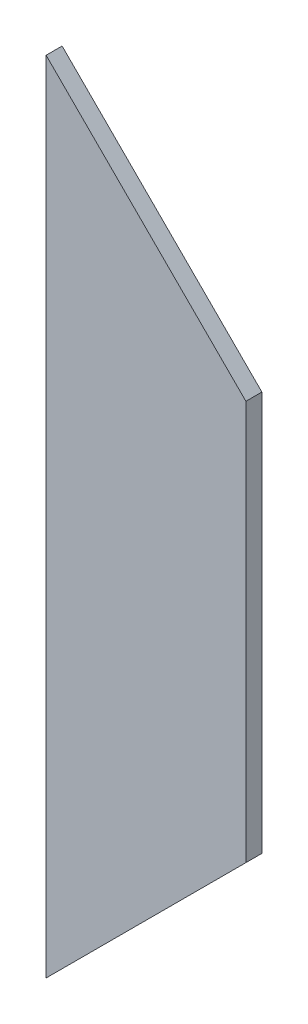
ISO-10303-21;
HEADER;
FILE_DESCRIPTION(('STEP AP214'),'2;1');
FILE_NAME('part.step','',(''),(''),'','','');
FILE_SCHEMA(('AUTOMOTIVE_DESIGN { 1 0 10303 214 1 1 1 1 }'));
ENDSEC;
DATA;
#1=APPLICATION_CONTEXT('core data for automotive mechanical design processes');
#2=APPLICATION_PROTOCOL_DEFINITION('international standard','automotive_design',2000,#1);
#3=PRODUCT_CONTEXT('',#1,'mechanical');
#4=PRODUCT('Part','Part','',(#3));
#5=PRODUCT_RELATED_PRODUCT_CATEGORY('part','',(#4));
#6=PRODUCT_DEFINITION_FORMATION('','',#4);
#7=PRODUCT_DEFINITION_CONTEXT('part definition',#1,'design');
#8=PRODUCT_DEFINITION('design','',#6,#7);
#9=PRODUCT_DEFINITION_SHAPE('','',#8);
#10=(LENGTH_UNIT() NAMED_UNIT(*) SI_UNIT(.MILLI.,.METRE.));
#11=(NAMED_UNIT(*) PLANE_ANGLE_UNIT() SI_UNIT($,.RADIAN.));
#12=(NAMED_UNIT(*) SI_UNIT($,.STERADIAN.) SOLID_ANGLE_UNIT());
#13=UNCERTAINTY_MEASURE_WITH_UNIT(LENGTH_MEASURE(1.E-05),#10,'distance_accuracy_value','');
#14=(GEOMETRIC_REPRESENTATION_CONTEXT(3) GLOBAL_UNCERTAINTY_ASSIGNED_CONTEXT((#13)) GLOBAL_UNIT_ASSIGNED_CONTEXT((#10,
#11,#12)) REPRESENTATION_CONTEXT('',''));
#15=CARTESIAN_POINT('',(0.,0.,0.));
#16=DIRECTION('',(0.,0.,1.));
#17=DIRECTION('',(1.,0.,0.));
#18=AXIS2_PLACEMENT_3D('',#15,#16,#17);
#19=CARTESIAN_POINT('',(0.,0.,4.));
#20=DIRECTION('',(-0.707106781186546,0.707106781186549,0.));
#21=DIRECTION('',(-0.707106781186549,-0.707106781186546,0.));
#22=AXIS2_PLACEMENT_3D('',#19,#20,#21);
#23=PLANE('',#22);
#24=DIRECTION('',(0.707106781186549,0.707106781186546,0.));
#25=VECTOR('',#24,1.);
#26=CARTESIAN_POINT('',(0.,0.,0.));
#27=LINE('',#26,#25);
#28=CARTESIAN_POINT('',(0.,0.,0.));
#29=VERTEX_POINT('',#28);
#30=CARTESIAN_POINT('',(50.,49.9999999999998,0.));
#31=VERTEX_POINT('',#30);
#32=EDGE_CURVE('E99',#29,#31,#27,.T.);
#33=ORIENTED_EDGE('',*,*,#32,.T.);
#34=DIRECTION('',(0.,0.,-1.));
#35=VECTOR('',#34,1.);
#36=CARTESIAN_POINT('',(50.,49.9999999999998,4.));
#37=LINE('',#36,#35);
#38=CARTESIAN_POINT('',(50.,49.9999999999998,4.));
#39=VERTEX_POINT('',#38);
#40=EDGE_CURVE('E11',#39,#31,#37,.T.);
#41=ORIENTED_EDGE('',*,*,#40,.F.);
#42=DIRECTION('',(0.707106781186549,0.707106781186546,0.));
#43=VECTOR('',#42,1.);
#44=CARTESIAN_POINT('',(0.,0.,4.));
#45=LINE('',#44,#43);
#46=CARTESIAN_POINT('',(0.,0.,4.));
#47=VERTEX_POINT('',#46);
#48=EDGE_CURVE('E87',#47,#39,#45,.T.);
#49=ORIENTED_EDGE('',*,*,#48,.F.);
#50=DIRECTION('',(0.,0.,-1.));
#51=VECTOR('',#50,1.);
#52=CARTESIAN_POINT('',(0.,0.,4.));
#53=LINE('',#52,#51);
#54=EDGE_CURVE('E95',#47,#29,#53,.T.);
#55=ORIENTED_EDGE('',*,*,#54,.T.);
#56=EDGE_LOOP('',(#33,#41,#49,#55));
#57=FACE_BOUND('',#56,.T.);
#58=ADVANCED_FACE('F36',(#57),#23,.F.);
#59=CARTESIAN_POINT('',(50.,49.9999999999998,4.));
#60=DIRECTION('',(-1.,0.,0.));
#61=DIRECTION('',(0.,0.,1.));
#62=AXIS2_PLACEMENT_3D('',#59,#60,#61);
#63=PLANE('',#62);
#64=DIRECTION('',(0.,1.,0.));
#65=VECTOR('',#64,1.);
#66=CARTESIAN_POINT('',(50.,49.9999999999998,0.));
#67=LINE('',#66,#65);
#68=CARTESIAN_POINT('',(50.,150.,0.));
#69=VERTEX_POINT('',#68);
#70=EDGE_CURVE('E91',#31,#69,#67,.T.);
#71=ORIENTED_EDGE('',*,*,#70,.T.);
#72=DIRECTION('',(0.,0.,-1.));
#73=VECTOR('',#72,1.);
#74=CARTESIAN_POINT('',(50.,150.,4.));
#75=LINE('',#74,#73);
#76=CARTESIAN_POINT('',(50.,150.,4.));
#77=VERTEX_POINT('',#76);
#78=EDGE_CURVE('E44',#77,#69,#75,.T.);
#79=ORIENTED_EDGE('',*,*,#78,.F.);
#80=DIRECTION('',(0.,1.,0.));
#81=VECTOR('',#80,1.);
#82=CARTESIAN_POINT('',(50.,49.9999999999998,4.));
#83=LINE('',#82,#81);
#84=EDGE_CURVE('E82',#39,#77,#83,.T.);
#85=ORIENTED_EDGE('',*,*,#84,.F.);
#86=ORIENTED_EDGE('',*,*,#40,.T.);
#87=EDGE_LOOP('',(#71,#79,#85,#86));
#88=FACE_BOUND('',#87,.T.);
#89=ADVANCED_FACE('F90',(#88),#63,.F.);
#90=CARTESIAN_POINT('',(50.,150.,4.));
#91=DIRECTION('',(-0.707106781186546,-0.707106781186549,0.));
#92=DIRECTION('',(0.707106781186549,-0.707106781186546,0.));
#93=AXIS2_PLACEMENT_3D('',#90,#91,#92);
#94=PLANE('',#93);
#95=DIRECTION('',(-0.707106781186549,0.707106781186546,0.));
#96=VECTOR('',#95,1.);
#97=CARTESIAN_POINT('',(50.,150.,0.));
#98=LINE('',#97,#96);
#99=CARTESIAN_POINT('',(0.,200.,0.));
#100=VERTEX_POINT('',#99);
#101=EDGE_CURVE('E69',#69,#100,#98,.T.);
#102=ORIENTED_EDGE('',*,*,#101,.T.);
#103=DIRECTION('',(0.,0.,-1.));
#104=VECTOR('',#103,1.);
#105=CARTESIAN_POINT('',(0.,200.,4.));
#106=LINE('',#105,#104);
#107=CARTESIAN_POINT('',(0.,200.,4.));
#108=VERTEX_POINT('',#107);
#109=EDGE_CURVE('E92',#108,#100,#106,.T.);
#110=ORIENTED_EDGE('',*,*,#109,.F.);
#111=DIRECTION('',(-0.707106781186549,0.707106781186546,0.));
#112=VECTOR('',#111,1.);
#113=CARTESIAN_POINT('',(50.,150.,4.));
#114=LINE('',#113,#112);
#115=EDGE_CURVE('E85',#77,#108,#114,.T.);
#116=ORIENTED_EDGE('',*,*,#115,.F.);
#117=ORIENTED_EDGE('',*,*,#78,.T.);
#118=EDGE_LOOP('',(#102,#110,#116,#117));
#119=FACE_BOUND('',#118,.T.);
#120=ADVANCED_FACE('F93',(#119),#94,.F.);
#121=CARTESIAN_POINT('',(0.,0.,4.));
#122=DIRECTION('',(1.,0.,0.));
#123=DIRECTION('',(0.,0.,-1.));
#124=AXIS2_PLACEMENT_3D('',#121,#122,#123);
#125=PLANE('',#124);
#126=DIRECTION('',(0.,-1.,0.));
#127=VECTOR('',#126,1.);
#128=CARTESIAN_POINT('',(0.,0.,0.));
#129=LINE('',#128,#127);
#130=EDGE_CURVE('E75',#100,#29,#129,.T.);
#131=ORIENTED_EDGE('',*,*,#130,.T.);
#132=ORIENTED_EDGE('',*,*,#54,.F.);
#133=DIRECTION('',(0.,-1.,0.));
#134=VECTOR('',#133,1.);
#135=CARTESIAN_POINT('',(0.,0.,4.));
#136=LINE('',#135,#134);
#137=EDGE_CURVE('E52',#108,#47,#136,.T.);
#138=ORIENTED_EDGE('',*,*,#137,.F.);
#139=ORIENTED_EDGE('',*,*,#109,.T.);
#140=EDGE_LOOP('',(#131,#132,#138,#139));
#141=FACE_BOUND('',#140,.T.);
#142=ADVANCED_FACE('F106',(#141),#125,.F.);
#143=CARTESIAN_POINT('',(0.,0.,4.));
#144=DIRECTION('',(0.,0.,1.));
#145=DIRECTION('',(1.,0.,0.));
#146=AXIS2_PLACEMENT_3D('',#143,#144,#145);
#147=PLANE('',#146);
#148=ORIENTED_EDGE('',*,*,#48,.T.);
#149=ORIENTED_EDGE('',*,*,#84,.T.);
#150=ORIENTED_EDGE('',*,*,#115,.T.);
#151=ORIENTED_EDGE('',*,*,#137,.T.);
#152=EDGE_LOOP('',(#148,#149,#150,#151));
#153=FACE_BOUND('',#152,.T.);
#154=ADVANCED_FACE('F83',(#153),#147,.T.);
#155=CARTESIAN_POINT('',(0.,0.,0.));
#156=DIRECTION('',(0.,0.,1.));
#157=DIRECTION('',(1.,0.,0.));
#158=AXIS2_PLACEMENT_3D('',#155,#156,#157);
#159=PLANE('',#158);
#160=ORIENTED_EDGE('',*,*,#32,.F.);
#161=ORIENTED_EDGE('',*,*,#130,.F.);
#162=ORIENTED_EDGE('',*,*,#101,.F.);
#163=ORIENTED_EDGE('',*,*,#70,.F.);
#164=EDGE_LOOP('',(#160,#161,#162,#163));
#165=FACE_BOUND('',#164,.T.);
#166=ADVANCED_FACE('F109',(#165),#159,.F.);
#167=CLOSED_SHELL('',(#58,#89,#120,#142,#154,#166));
#168=MANIFOLD_SOLID_BREP('B2',#167);
#169=ADVANCED_BREP_SHAPE_REPRESENTATION('',(#18,#168),#14);
#170=SHAPE_DEFINITION_REPRESENTATION(#9,#169);
ENDSEC;
END-ISO-10303-21;
